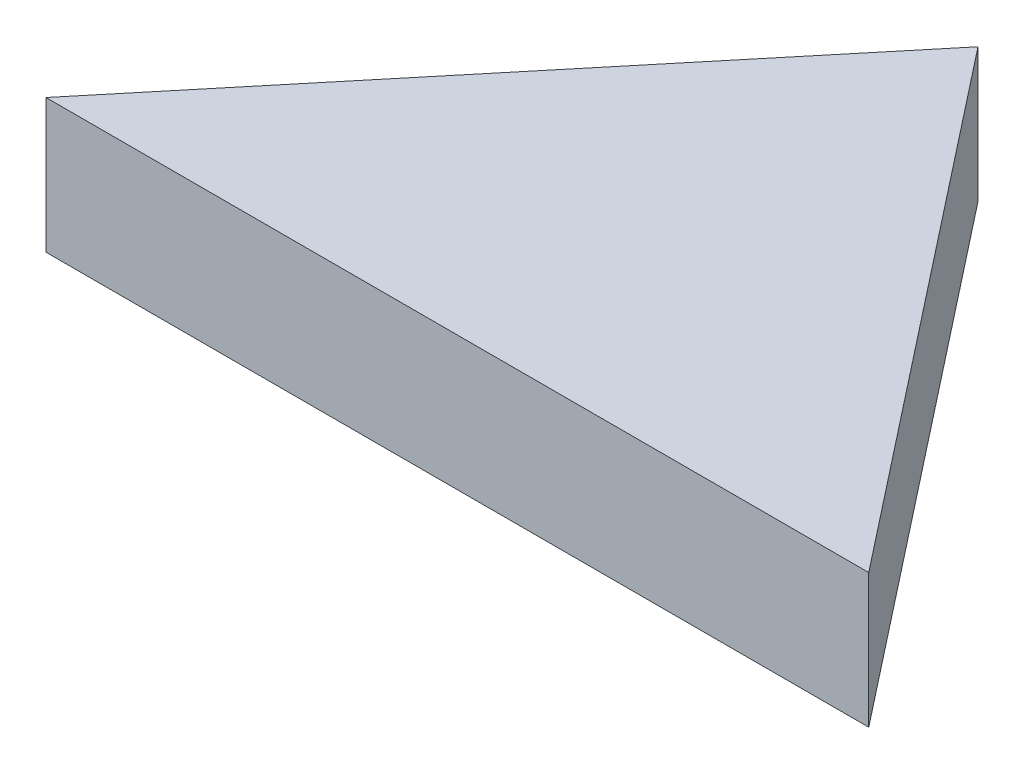
ISO-10303-21;
HEADER;
FILE_DESCRIPTION(('STEP AP214'),'2;1');
FILE_NAME('part.step','',(''),(''),'','','');
FILE_SCHEMA(('AUTOMOTIVE_DESIGN { 1 0 10303 214 1 1 1 1 }'));
ENDSEC;
DATA;
#1=APPLICATION_CONTEXT('core data for automotive mechanical design processes');
#2=APPLICATION_PROTOCOL_DEFINITION('international standard','automotive_design',2000,#1);
#3=PRODUCT_CONTEXT('',#1,'mechanical');
#4=PRODUCT('Part','Part','',(#3));
#5=PRODUCT_RELATED_PRODUCT_CATEGORY('part','',(#4));
#6=PRODUCT_DEFINITION_FORMATION('','',#4);
#7=PRODUCT_DEFINITION_CONTEXT('part definition',#1,'design');
#8=PRODUCT_DEFINITION('design','',#6,#7);
#9=PRODUCT_DEFINITION_SHAPE('','',#8);
#10=(LENGTH_UNIT() NAMED_UNIT(*) SI_UNIT(.MILLI.,.METRE.));
#11=(NAMED_UNIT(*) PLANE_ANGLE_UNIT() SI_UNIT($,.RADIAN.));
#12=(NAMED_UNIT(*) SI_UNIT($,.STERADIAN.) SOLID_ANGLE_UNIT());
#13=UNCERTAINTY_MEASURE_WITH_UNIT(LENGTH_MEASURE(1.E-05),#10,'distance_accuracy_value','');
#14=(GEOMETRIC_REPRESENTATION_CONTEXT(3) GLOBAL_UNCERTAINTY_ASSIGNED_CONTEXT((#13)) GLOBAL_UNIT_ASSIGNED_CONTEXT((#10,
#11,#12)) REPRESENTATION_CONTEXT('',''));
#15=CARTESIAN_POINT('',(0.,0.,0.));
#16=DIRECTION('',(0.,0.,1.));
#17=DIRECTION('',(1.,0.,0.));
#18=AXIS2_PLACEMENT_3D('',#15,#16,#17);
#19=CARTESIAN_POINT('',(6.14,1.,0.));
#20=DIRECTION('',(0.,0.,-1.));
#21=DIRECTION('',(-1.,0.,0.));
#22=AXIS2_PLACEMENT_3D('',#19,#20,#21);
#23=PLANE('',#22);
#24=DIRECTION('',(1.,0.,0.));
#25=VECTOR('',#24,1.);
#26=CARTESIAN_POINT('',(6.14,0.,0.));
#27=LINE('',#26,#25);
#28=CARTESIAN_POINT('',(0.,0.,0.));
#29=VERTEX_POINT('',#28);
#30=CARTESIAN_POINT('',(6.14,0.,0.));
#31=VERTEX_POINT('',#30);
#32=EDGE_CURVE('E80',#29,#31,#27,.T.);
#33=ORIENTED_EDGE('',*,*,#32,.T.);
#34=DIRECTION('',(0.,-1.,0.));
#35=VECTOR('',#34,1.);
#36=CARTESIAN_POINT('',(6.14,1.,0.));
#37=LINE('',#36,#35);
#38=CARTESIAN_POINT('',(6.14,1.,0.));
#39=VERTEX_POINT('',#38);
#40=EDGE_CURVE('E11',#39,#31,#37,.T.);
#41=ORIENTED_EDGE('',*,*,#40,.F.);
#42=DIRECTION('',(1.,0.,0.));
#43=VECTOR('',#42,1.);
#44=CARTESIAN_POINT('',(6.14,1.,0.));
#45=LINE('',#44,#43);
#46=CARTESIAN_POINT('',(0.,1.,0.));
#47=VERTEX_POINT('',#46);
#48=EDGE_CURVE('E73',#47,#39,#45,.T.);
#49=ORIENTED_EDGE('',*,*,#48,.F.);
#50=DIRECTION('',(0.,-1.,0.));
#51=VECTOR('',#50,1.);
#52=CARTESIAN_POINT('',(0.,1.,0.));
#53=LINE('',#52,#51);
#54=EDGE_CURVE('E81',#47,#29,#53,.T.);
#55=ORIENTED_EDGE('',*,*,#54,.T.);
#56=EDGE_LOOP('',(#33,#41,#49,#55));
#57=FACE_BOUND('',#56,.T.);
#58=ADVANCED_FACE('F33',(#57),#23,.F.);
#59=CARTESIAN_POINT('',(3.14964169381108,1.,-3.80570061888832));
#60=DIRECTION('',(-0.786301780762049,0.,0.617842625245645));
#61=DIRECTION('',(0.617842625245645,0.,0.786301780762049));
#62=AXIS2_PLACEMENT_3D('',#59,#60,#61);
#63=PLANE('',#62);
#64=DIRECTION('',(-0.617842625245645,0.,-0.786301780762049));
#65=VECTOR('',#64,1.);
#66=CARTESIAN_POINT('',(3.14964169381108,0.,-3.80570061888832));
#67=LINE('',#66,#65);
#68=CARTESIAN_POINT('',(3.14964169381108,0.,-3.80570061888832));
#69=VERTEX_POINT('',#68);
#70=EDGE_CURVE('E61',#31,#69,#67,.T.);
#71=ORIENTED_EDGE('',*,*,#70,.T.);
#72=DIRECTION('',(0.,-1.,0.));
#73=VECTOR('',#72,1.);
#74=CARTESIAN_POINT('',(3.14964169381108,1.,-3.80570061888832));
#75=LINE('',#74,#73);
#76=CARTESIAN_POINT('',(3.14964169381108,1.,-3.80570061888832));
#77=VERTEX_POINT('',#76);
#78=EDGE_CURVE('E41',#77,#69,#75,.T.);
#79=ORIENTED_EDGE('',*,*,#78,.F.);
#80=DIRECTION('',(-0.617842625245645,0.,-0.786301780762049));
#81=VECTOR('',#80,1.);
#82=CARTESIAN_POINT('',(3.14964169381108,1.,-3.80570061888832));
#83=LINE('',#82,#81);
#84=EDGE_CURVE('E69',#39,#77,#83,.T.);
#85=ORIENTED_EDGE('',*,*,#84,.F.);
#86=ORIENTED_EDGE('',*,*,#40,.T.);
#87=EDGE_LOOP('',(#71,#79,#85,#86));
#88=FACE_BOUND('',#87,.T.);
#89=ADVANCED_FACE('F70',(#88),#63,.F.);
#90=CARTESIAN_POINT('',(0.,1.,0.));
#91=DIRECTION('',(0.770384740665651,0.,0.637579290245157));
#92=DIRECTION('',(0.637579290245157,0.,-0.770384740665651));
#93=AXIS2_PLACEMENT_3D('',#90,#91,#92);
#94=PLANE('',#93);
#95=DIRECTION('',(-0.637579290245157,0.,0.770384740665651));
#96=VECTOR('',#95,1.);
#97=CARTESIAN_POINT('',(0.,0.,0.));
#98=LINE('',#97,#96);
#99=EDGE_CURVE('E66',#69,#29,#98,.T.);
#100=ORIENTED_EDGE('',*,*,#99,.T.);
#101=ORIENTED_EDGE('',*,*,#54,.F.);
#102=DIRECTION('',(-0.637579290245157,0.,0.770384740665651));
#103=VECTOR('',#102,1.);
#104=CARTESIAN_POINT('',(0.,1.,0.));
#105=LINE('',#104,#103);
#106=EDGE_CURVE('E49',#77,#47,#105,.T.);
#107=ORIENTED_EDGE('',*,*,#106,.F.);
#108=ORIENTED_EDGE('',*,*,#78,.T.);
#109=EDGE_LOOP('',(#100,#101,#107,#108));
#110=FACE_BOUND('',#109,.T.);
#111=ADVANCED_FACE('F88',(#110),#94,.F.);
#112=CARTESIAN_POINT('',(0.,1.,0.));
#113=DIRECTION('',(0.,1.,0.));
#114=DIRECTION('',(0.,0.,1.));
#115=AXIS2_PLACEMENT_3D('',#112,#113,#114);
#116=PLANE('',#115);
#117=ORIENTED_EDGE('',*,*,#48,.T.);
#118=ORIENTED_EDGE('',*,*,#84,.T.);
#119=ORIENTED_EDGE('',*,*,#106,.T.);
#120=EDGE_LOOP('',(#117,#118,#119));
#121=FACE_BOUND('',#120,.T.);
#122=ADVANCED_FACE('F76',(#121),#116,.T.);
#123=CARTESIAN_POINT('',(0.,0.,0.));
#124=DIRECTION('',(0.,1.,0.));
#125=DIRECTION('',(0.,0.,1.));
#126=AXIS2_PLACEMENT_3D('',#123,#124,#125);
#127=PLANE('',#126);
#128=ORIENTED_EDGE('',*,*,#32,.F.);
#129=ORIENTED_EDGE('',*,*,#99,.F.);
#130=ORIENTED_EDGE('',*,*,#70,.F.);
#131=EDGE_LOOP('',(#128,#129,#130));
#132=FACE_BOUND('',#131,.T.);
#133=ADVANCED_FACE('F89',(#132),#127,.F.);
#134=CLOSED_SHELL('',(#58,#89,#111,#122,#133));
#135=MANIFOLD_SOLID_BREP('B2',#134);
#136=ADVANCED_BREP_SHAPE_REPRESENTATION('',(#18,#135),#14);
#137=SHAPE_DEFINITION_REPRESENTATION(#9,#136);
ENDSEC;
END-ISO-10303-21;
